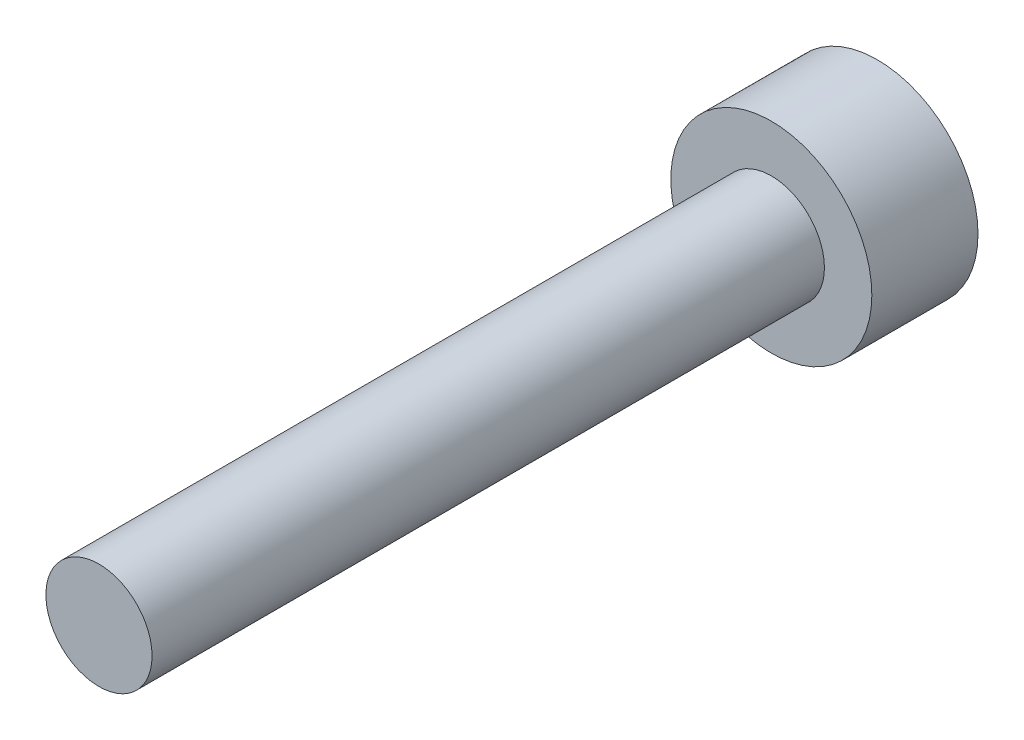
ISO-10303-21;
HEADER;
FILE_DESCRIPTION(('STEP AP214'),'2;1');
FILE_NAME('part.step','',(''),(''),'','','');
FILE_SCHEMA(('AUTOMOTIVE_DESIGN { 1 0 10303 214 1 1 1 1 }'));
ENDSEC;
DATA;
#1=APPLICATION_CONTEXT('core data for automotive mechanical design processes');
#2=APPLICATION_PROTOCOL_DEFINITION('international standard','automotive_design',2000,#1);
#3=PRODUCT_CONTEXT('',#1,'mechanical');
#4=PRODUCT('Part','Part','',(#3));
#5=PRODUCT_RELATED_PRODUCT_CATEGORY('part','',(#4));
#6=PRODUCT_DEFINITION_FORMATION('','',#4);
#7=PRODUCT_DEFINITION_CONTEXT('part definition',#1,'design');
#8=PRODUCT_DEFINITION('design','',#6,#7);
#9=PRODUCT_DEFINITION_SHAPE('','',#8);
#10=(LENGTH_UNIT() NAMED_UNIT(*) SI_UNIT(.MILLI.,.METRE.));
#11=(NAMED_UNIT(*) PLANE_ANGLE_UNIT() SI_UNIT($,.RADIAN.));
#12=(NAMED_UNIT(*) SI_UNIT($,.STERADIAN.) SOLID_ANGLE_UNIT());
#13=UNCERTAINTY_MEASURE_WITH_UNIT(LENGTH_MEASURE(1.E-05),#10,'distance_accuracy_value','');
#14=(GEOMETRIC_REPRESENTATION_CONTEXT(3) GLOBAL_UNCERTAINTY_ASSIGNED_CONTEXT((#13)) GLOBAL_UNIT_ASSIGNED_CONTEXT((#10,
#11,#12)) REPRESENTATION_CONTEXT('',''));
#15=CARTESIAN_POINT('',(0.,0.,0.));
#16=DIRECTION('',(0.,0.,1.));
#17=DIRECTION('',(1.,0.,0.));
#18=AXIS2_PLACEMENT_3D('',#15,#16,#17);
#19=CARTESIAN_POINT('',(0.,0.,3.));
#20=DIRECTION('',(0.,0.,-1.));
#21=DIRECTION('',(-1.,0.,0.));
#22=AXIS2_PLACEMENT_3D('',#19,#20,#21);
#23=CYLINDRICAL_SURFACE('',#22,2.84);
#24=CARTESIAN_POINT('',(0.,0.,3.));
#25=DIRECTION('',(0.,0.,1.));
#26=DIRECTION('',(1.,0.,0.));
#27=AXIS2_PLACEMENT_3D('',#24,#25,#26);
#28=CIRCLE('',#27,2.84);
#29=CARTESIAN_POINT('',(2.84,0.,3.));
#30=VERTEX_POINT('',#29);
#31=EDGE_CURVE('E10',#30,#30,#28,.T.);
#32=ORIENTED_EDGE('',*,*,#31,.F.);
#33=EDGE_LOOP('',(#32));
#34=FACE_BOUND('',#33,.T.);
#35=CARTESIAN_POINT('',(0.,0.,0.));
#36=DIRECTION('',(0.,0.,1.));
#37=DIRECTION('',(1.,0.,0.));
#38=AXIS2_PLACEMENT_3D('',#35,#36,#37);
#39=CIRCLE('',#38,2.84);
#40=CARTESIAN_POINT('',(2.84,0.,0.));
#41=VERTEX_POINT('',#40);
#42=EDGE_CURVE('E35',#41,#41,#39,.T.);
#43=ORIENTED_EDGE('',*,*,#42,.T.);
#44=EDGE_LOOP('',(#43));
#45=FACE_BOUND('',#44,.T.);
#46=ADVANCED_FACE('F32',(#34,#45),#23,.T.);
#47=CARTESIAN_POINT('',(0.,0.,3.));
#48=DIRECTION('',(0.,0.,1.));
#49=DIRECTION('',(1.,0.,0.));
#50=AXIS2_PLACEMENT_3D('',#47,#48,#49);
#51=PLANE('',#50);
#52=CARTESIAN_POINT('',(0.,0.,3.));
#53=DIRECTION('',(0.,0.,1.));
#54=DIRECTION('',(1.,0.,0.));
#55=AXIS2_PLACEMENT_3D('',#52,#53,#54);
#56=CIRCLE('',#55,1.5);
#57=CARTESIAN_POINT('',(1.5,0.,3.));
#58=VERTEX_POINT('',#57);
#59=EDGE_CURVE('E42',#58,#58,#56,.F.);
#60=ORIENTED_EDGE('',*,*,#59,.T.);
#61=EDGE_LOOP('',(#60));
#62=FACE_BOUND('',#61,.T.);
#63=ORIENTED_EDGE('',*,*,#31,.T.);
#64=EDGE_LOOP('',(#63));
#65=FACE_BOUND('',#64,.T.);
#66=ADVANCED_FACE('F62',(#62,#65),#51,.T.);
#67=CARTESIAN_POINT('',(0.,0.,0.));
#68=DIRECTION('',(0.,0.,1.));
#69=DIRECTION('',(1.,0.,0.));
#70=AXIS2_PLACEMENT_3D('',#67,#68,#69);
#71=PLANE('',#70);
#72=ORIENTED_EDGE('',*,*,#42,.F.);
#73=EDGE_LOOP('',(#72));
#74=FACE_BOUND('',#73,.T.);
#75=ADVANCED_FACE('F54',(#74),#71,.F.);
#76=CARTESIAN_POINT('',(0.,0.,22.));
#77=DIRECTION('',(0.,0.,-1.));
#78=DIRECTION('',(-1.,0.,0.));
#79=AXIS2_PLACEMENT_3D('',#76,#77,#78);
#80=CYLINDRICAL_SURFACE('',#79,1.5);
#81=ORIENTED_EDGE('',*,*,#59,.F.);
#82=EDGE_LOOP('',(#81));
#83=FACE_BOUND('',#82,.T.);
#84=CARTESIAN_POINT('',(0.,0.,22.));
#85=DIRECTION('',(0.,0.,1.));
#86=DIRECTION('',(1.,0.,0.));
#87=AXIS2_PLACEMENT_3D('',#84,#85,#86);
#88=CIRCLE('',#87,1.5);
#89=CARTESIAN_POINT('',(1.5,0.,22.));
#90=VERTEX_POINT('',#89);
#91=EDGE_CURVE('E46',#90,#90,#88,.T.);
#92=ORIENTED_EDGE('',*,*,#91,.F.);
#93=EDGE_LOOP('',(#92));
#94=FACE_BOUND('',#93,.T.);
#95=ADVANCED_FACE('F52',(#83,#94),#80,.T.);
#96=CARTESIAN_POINT('',(0.,0.,22.));
#97=DIRECTION('',(0.,0.,1.));
#98=DIRECTION('',(1.,0.,0.));
#99=AXIS2_PLACEMENT_3D('',#96,#97,#98);
#100=PLANE('',#99);
#101=ORIENTED_EDGE('',*,*,#91,.T.);
#102=EDGE_LOOP('',(#101));
#103=FACE_BOUND('',#102,.T.);
#104=ADVANCED_FACE('F50',(#103),#100,.T.);
#105=CLOSED_SHELL('',(#46,#66,#75,#95,#104));
#106=MANIFOLD_SOLID_BREP('B2',#105);
#107=ADVANCED_BREP_SHAPE_REPRESENTATION('',(#18,#106),#14);
#108=SHAPE_DEFINITION_REPRESENTATION(#9,#107);
ENDSEC;
END-ISO-10303-21;
